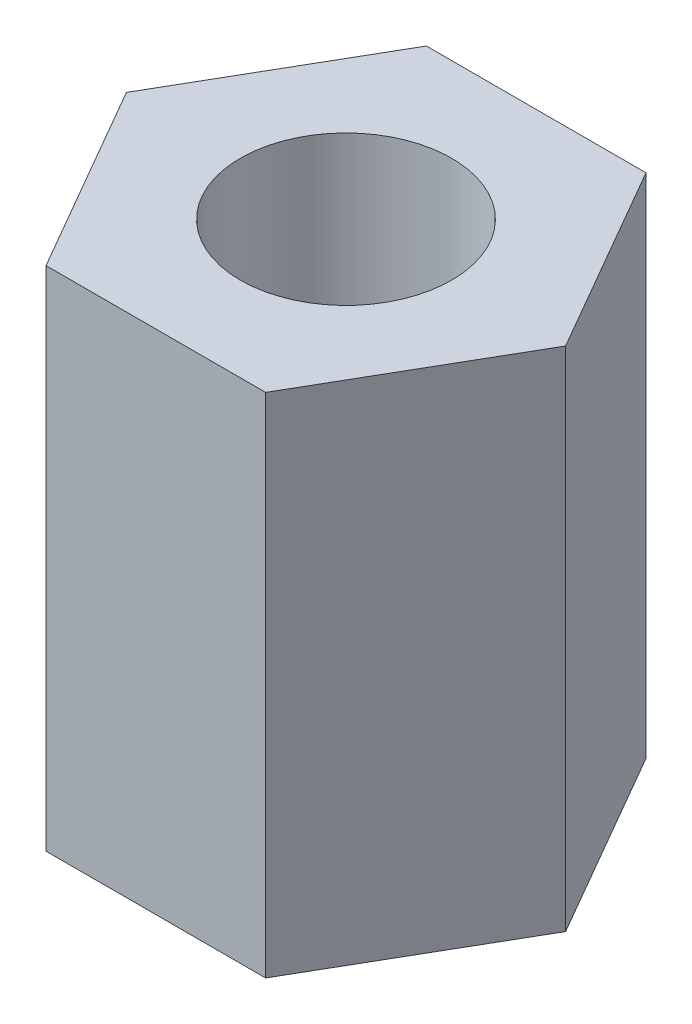
ISO-10303-21;
HEADER;
FILE_DESCRIPTION(('STEP AP214'),'2;1');
FILE_NAME('part.step','',(''),(''),'','','');
FILE_SCHEMA(('AUTOMOTIVE_DESIGN { 1 0 10303 214 1 1 1 1 }'));
ENDSEC;
DATA;
#1=APPLICATION_CONTEXT('core data for automotive mechanical design processes');
#2=APPLICATION_PROTOCOL_DEFINITION('international standard','automotive_design',2000,#1);
#3=PRODUCT_CONTEXT('',#1,'mechanical');
#4=PRODUCT('Part','Part','',(#3));
#5=PRODUCT_RELATED_PRODUCT_CATEGORY('part','',(#4));
#6=PRODUCT_DEFINITION_FORMATION('','',#4);
#7=PRODUCT_DEFINITION_CONTEXT('part definition',#1,'design');
#8=PRODUCT_DEFINITION('design','',#6,#7);
#9=PRODUCT_DEFINITION_SHAPE('','',#8);
#10=(LENGTH_UNIT() NAMED_UNIT(*) SI_UNIT(.MILLI.,.METRE.));
#11=(NAMED_UNIT(*) PLANE_ANGLE_UNIT() SI_UNIT($,.RADIAN.));
#12=(NAMED_UNIT(*) SI_UNIT($,.STERADIAN.) SOLID_ANGLE_UNIT());
#13=UNCERTAINTY_MEASURE_WITH_UNIT(LENGTH_MEASURE(1.E-05),#10,'distance_accuracy_value','');
#14=(GEOMETRIC_REPRESENTATION_CONTEXT(3) GLOBAL_UNCERTAINTY_ASSIGNED_CONTEXT((#13)) GLOBAL_UNIT_ASSIGNED_CONTEXT((#10,
#11,#12)) REPRESENTATION_CONTEXT('',''));
#15=CARTESIAN_POINT('',(0.,0.,0.));
#16=DIRECTION('',(0.,0.,1.));
#17=DIRECTION('',(1.,0.,0.));
#18=AXIS2_PLACEMENT_3D('',#15,#16,#17);
#19=CARTESIAN_POINT('',(0.,6.,0.));
#20=DIRECTION('',(0.,1.,0.));
#21=DIRECTION('',(0.,0.,1.));
#22=AXIS2_PLACEMENT_3D('',#19,#20,#21);
#23=PLANE('',#22);
#24=DIRECTION('',(1.,0.,0.));
#25=VECTOR('',#24,1.);
#26=CARTESIAN_POINT('',(-1.29903810567666,6.,2.25));
#27=LINE('',#26,#25);
#28=CARTESIAN_POINT('',(-1.29903810567666,6.,2.25));
#29=VERTEX_POINT('',#28);
#30=CARTESIAN_POINT('',(1.29903810567666,6.,2.25));
#31=VERTEX_POINT('',#30);
#32=EDGE_CURVE('E134',#29,#31,#27,.T.);
#33=ORIENTED_EDGE('',*,*,#32,.T.);
#34=DIRECTION('',(0.5,0.,-0.866025403784439));
#35=VECTOR('',#34,1.);
#36=CARTESIAN_POINT('',(1.29903810567666,6.,2.25));
#37=LINE('',#36,#35);
#38=CARTESIAN_POINT('',(2.59807621135332,6.,0.));
#39=VERTEX_POINT('',#38);
#40=EDGE_CURVE('E92',#31,#39,#37,.T.);
#41=ORIENTED_EDGE('',*,*,#40,.T.);
#42=DIRECTION('',(-0.5,0.,-0.866025403784438));
#43=VECTOR('',#42,1.);
#44=CARTESIAN_POINT('',(2.59807621135332,6.,0.));
#45=LINE('',#44,#43);
#46=CARTESIAN_POINT('',(1.29903810567666,6.,-2.25));
#47=VERTEX_POINT('',#46);
#48=EDGE_CURVE('E105',#39,#47,#45,.T.);
#49=ORIENTED_EDGE('',*,*,#48,.T.);
#50=DIRECTION('',(-1.,0.,0.));
#51=VECTOR('',#50,1.);
#52=CARTESIAN_POINT('',(1.29903810567666,6.,-2.25));
#53=LINE('',#52,#51);
#54=CARTESIAN_POINT('',(-1.29903810567666,6.,-2.25));
#55=VERTEX_POINT('',#54);
#56=EDGE_CURVE('E99',#47,#55,#53,.T.);
#57=ORIENTED_EDGE('',*,*,#56,.T.);
#58=DIRECTION('',(-0.5,0.,0.866025403784439));
#59=VECTOR('',#58,1.);
#60=CARTESIAN_POINT('',(-1.29903810567666,6.,-2.25));
#61=LINE('',#60,#59);
#62=CARTESIAN_POINT('',(-2.59807621135332,6.,0.));
#63=VERTEX_POINT('',#62);
#64=EDGE_CURVE('E103',#55,#63,#61,.T.);
#65=ORIENTED_EDGE('',*,*,#64,.T.);
#66=DIRECTION('',(0.5,0.,0.866025403784438));
#67=VECTOR('',#66,1.);
#68=CARTESIAN_POINT('',(-2.59807621135332,6.,0.));
#69=LINE('',#68,#67);
#70=EDGE_CURVE('E55',#63,#29,#69,.T.);
#71=ORIENTED_EDGE('',*,*,#70,.T.);
#72=EDGE_LOOP('',(#33,#41,#49,#57,#65,#71));
#73=FACE_BOUND('',#72,.T.);
#74=CARTESIAN_POINT('',(0.,6.,0.));
#75=DIRECTION('',(0.,1.,0.));
#76=DIRECTION('',(0.,0.,1.));
#77=AXIS2_PLACEMENT_3D('',#74,#75,#76);
#78=CIRCLE('',#77,1.25);
#79=CARTESIAN_POINT('',(0.,6.,1.25));
#80=VERTEX_POINT('',#79);
#81=EDGE_CURVE('E127',#80,#80,#78,.T.);
#82=ORIENTED_EDGE('',*,*,#81,.F.);
#83=EDGE_LOOP('',(#82));
#84=FACE_BOUND('',#83,.T.);
#85=ADVANCED_FACE('F38',(#73,#84),#23,.T.);
#86=CARTESIAN_POINT('',(0.,0.,0.));
#87=DIRECTION('',(0.,1.,0.));
#88=DIRECTION('',(0.,0.,1.));
#89=AXIS2_PLACEMENT_3D('',#86,#87,#88);
#90=PLANE('',#89);
#91=DIRECTION('',(1.,0.,0.));
#92=VECTOR('',#91,1.);
#93=CARTESIAN_POINT('',(-1.29903810567666,0.,2.25));
#94=LINE('',#93,#92);
#95=CARTESIAN_POINT('',(-1.29903810567666,0.,2.25));
#96=VERTEX_POINT('',#95);
#97=CARTESIAN_POINT('',(1.29903810567666,0.,2.25));
#98=VERTEX_POINT('',#97);
#99=EDGE_CURVE('E123',#96,#98,#94,.T.);
#100=ORIENTED_EDGE('',*,*,#99,.F.);
#101=DIRECTION('',(0.5,0.,0.866025403784438));
#102=VECTOR('',#101,1.);
#103=CARTESIAN_POINT('',(-2.59807621135332,0.,0.));
#104=LINE('',#103,#102);
#105=CARTESIAN_POINT('',(-2.59807621135332,0.,0.));
#106=VERTEX_POINT('',#105);
#107=EDGE_CURVE('E84',#106,#96,#104,.T.);
#108=ORIENTED_EDGE('',*,*,#107,.F.);
#109=DIRECTION('',(-0.5,0.,0.866025403784439));
#110=VECTOR('',#109,1.);
#111=CARTESIAN_POINT('',(-1.29903810567666,0.,-2.25));
#112=LINE('',#111,#110);
#113=CARTESIAN_POINT('',(-1.29903810567666,0.,-2.25));
#114=VERTEX_POINT('',#113);
#115=EDGE_CURVE('E78',#114,#106,#112,.T.);
#116=ORIENTED_EDGE('',*,*,#115,.F.);
#117=DIRECTION('',(-1.,0.,0.));
#118=VECTOR('',#117,1.);
#119=CARTESIAN_POINT('',(1.29903810567666,0.,-2.25));
#120=LINE('',#119,#118);
#121=CARTESIAN_POINT('',(1.29903810567666,0.,-2.25));
#122=VERTEX_POINT('',#121);
#123=EDGE_CURVE('E113',#122,#114,#120,.T.);
#124=ORIENTED_EDGE('',*,*,#123,.F.);
#125=DIRECTION('',(-0.5,0.,-0.866025403784438));
#126=VECTOR('',#125,1.);
#127=CARTESIAN_POINT('',(2.59807621135332,0.,0.));
#128=LINE('',#127,#126);
#129=CARTESIAN_POINT('',(2.59807621135332,0.,0.));
#130=VERTEX_POINT('',#129);
#131=EDGE_CURVE('E129',#130,#122,#128,.T.);
#132=ORIENTED_EDGE('',*,*,#131,.F.);
#133=DIRECTION('',(0.5,0.,-0.866025403784439));
#134=VECTOR('',#133,1.);
#135=CARTESIAN_POINT('',(1.29903810567666,0.,2.25));
#136=LINE('',#135,#134);
#137=EDGE_CURVE('E126',#98,#130,#136,.T.);
#138=ORIENTED_EDGE('',*,*,#137,.F.);
#139=EDGE_LOOP('',(#100,#108,#116,#124,#132,#138));
#140=FACE_BOUND('',#139,.T.);
#141=CARTESIAN_POINT('',(0.,0.,0.));
#142=DIRECTION('',(0.,1.,0.));
#143=DIRECTION('',(0.,0.,1.));
#144=AXIS2_PLACEMENT_3D('',#141,#142,#143);
#145=CIRCLE('',#144,1.25);
#146=CARTESIAN_POINT('',(0.,0.,1.25));
#147=VERTEX_POINT('',#146);
#148=EDGE_CURVE('E245',#147,#147,#145,.T.);
#149=ORIENTED_EDGE('',*,*,#148,.T.);
#150=EDGE_LOOP('',(#149));
#151=FACE_BOUND('',#150,.T.);
#152=ADVANCED_FACE('F143',(#140,#151),#90,.F.);
#153=CARTESIAN_POINT('',(-1.29903810567666,6.,2.25));
#154=DIRECTION('',(0.,0.,-1.));
#155=DIRECTION('',(-1.,0.,0.));
#156=AXIS2_PLACEMENT_3D('',#153,#154,#155);
#157=PLANE('',#156);
#158=ORIENTED_EDGE('',*,*,#99,.T.);
#159=DIRECTION('',(0.,-1.,0.));
#160=VECTOR('',#159,1.);
#161=CARTESIAN_POINT('',(1.29903810567666,6.,2.25));
#162=LINE('',#161,#160);
#163=EDGE_CURVE('E11',#31,#98,#162,.T.);
#164=ORIENTED_EDGE('',*,*,#163,.F.);
#165=ORIENTED_EDGE('',*,*,#32,.F.);
#166=DIRECTION('',(0.,-1.,0.));
#167=VECTOR('',#166,1.);
#168=CARTESIAN_POINT('',(-1.29903810567666,6.,2.25));
#169=LINE('',#168,#167);
#170=EDGE_CURVE('E119',#29,#96,#169,.T.);
#171=ORIENTED_EDGE('',*,*,#170,.T.);
#172=EDGE_LOOP('',(#158,#164,#165,#171));
#173=FACE_BOUND('',#172,.T.);
#174=ADVANCED_FACE('F40',(#173),#157,.F.);
#175=CARTESIAN_POINT('',(1.29903810567666,6.,2.25));
#176=DIRECTION('',(-0.866025403784438,0.,-0.5));
#177=DIRECTION('',(-0.5,0.,0.866025403784439));
#178=AXIS2_PLACEMENT_3D('',#175,#176,#177);
#179=PLANE('',#178);
#180=ORIENTED_EDGE('',*,*,#137,.T.);
#181=DIRECTION('',(0.,-1.,0.));
#182=VECTOR('',#181,1.);
#183=CARTESIAN_POINT('',(2.59807621135332,6.,0.));
#184=LINE('',#183,#182);
#185=EDGE_CURVE('E47',#39,#130,#184,.T.);
#186=ORIENTED_EDGE('',*,*,#185,.F.);
#187=ORIENTED_EDGE('',*,*,#40,.F.);
#188=ORIENTED_EDGE('',*,*,#163,.T.);
#189=EDGE_LOOP('',(#180,#186,#187,#188));
#190=FACE_BOUND('',#189,.T.);
#191=ADVANCED_FACE('F168',(#190),#179,.F.);
#192=CARTESIAN_POINT('',(2.59807621135332,6.,0.));
#193=DIRECTION('',(-0.866025403784438,0.,0.5));
#194=DIRECTION('',(0.5,0.,0.866025403784438));
#195=AXIS2_PLACEMENT_3D('',#192,#193,#194);
#196=PLANE('',#195);
#197=ORIENTED_EDGE('',*,*,#131,.T.);
#198=DIRECTION('',(0.,-1.,0.));
#199=VECTOR('',#198,1.);
#200=CARTESIAN_POINT('',(1.29903810567666,6.,-2.25));
#201=LINE('',#200,#199);
#202=EDGE_CURVE('E114',#47,#122,#201,.T.);
#203=ORIENTED_EDGE('',*,*,#202,.F.);
#204=ORIENTED_EDGE('',*,*,#48,.F.);
#205=ORIENTED_EDGE('',*,*,#185,.T.);
#206=EDGE_LOOP('',(#197,#203,#204,#205));
#207=FACE_BOUND('',#206,.T.);
#208=ADVANCED_FACE('F140',(#207),#196,.F.);
#209=CARTESIAN_POINT('',(1.29903810567666,6.,-2.25));
#210=DIRECTION('',(0.,0.,1.));
#211=DIRECTION('',(1.,0.,0.));
#212=AXIS2_PLACEMENT_3D('',#209,#210,#211);
#213=PLANE('',#212);
#214=ORIENTED_EDGE('',*,*,#123,.T.);
#215=DIRECTION('',(0.,-1.,0.));
#216=VECTOR('',#215,1.);
#217=CARTESIAN_POINT('',(-1.29903810567666,6.,-2.25));
#218=LINE('',#217,#216);
#219=EDGE_CURVE('E110',#55,#114,#218,.T.);
#220=ORIENTED_EDGE('',*,*,#219,.F.);
#221=ORIENTED_EDGE('',*,*,#56,.F.);
#222=ORIENTED_EDGE('',*,*,#202,.T.);
#223=EDGE_LOOP('',(#214,#220,#221,#222));
#224=FACE_BOUND('',#223,.T.);
#225=ADVANCED_FACE('F111',(#224),#213,.F.);
#226=CARTESIAN_POINT('',(-1.29903810567666,6.,-2.25));
#227=DIRECTION('',(0.866025403784438,0.,0.5));
#228=DIRECTION('',(0.5,0.,-0.866025403784439));
#229=AXIS2_PLACEMENT_3D('',#226,#227,#228);
#230=PLANE('',#229);
#231=ORIENTED_EDGE('',*,*,#115,.T.);
#232=DIRECTION('',(0.,-1.,0.));
#233=VECTOR('',#232,1.);
#234=CARTESIAN_POINT('',(-2.59807621135332,6.,0.));
#235=LINE('',#234,#233);
#236=EDGE_CURVE('E115',#63,#106,#235,.T.);
#237=ORIENTED_EDGE('',*,*,#236,.F.);
#238=ORIENTED_EDGE('',*,*,#64,.F.);
#239=ORIENTED_EDGE('',*,*,#219,.T.);
#240=EDGE_LOOP('',(#231,#237,#238,#239));
#241=FACE_BOUND('',#240,.T.);
#242=ADVANCED_FACE('F117',(#241),#230,.F.);
#243=CARTESIAN_POINT('',(-2.59807621135332,6.,0.));
#244=DIRECTION('',(0.866025403784439,0.,-0.5));
#245=DIRECTION('',(-0.5,0.,-0.866025403784439));
#246=AXIS2_PLACEMENT_3D('',#243,#244,#245);
#247=PLANE('',#246);
#248=ORIENTED_EDGE('',*,*,#107,.T.);
#249=ORIENTED_EDGE('',*,*,#170,.F.);
#250=ORIENTED_EDGE('',*,*,#70,.F.);
#251=ORIENTED_EDGE('',*,*,#236,.T.);
#252=EDGE_LOOP('',(#248,#249,#250,#251));
#253=FACE_BOUND('',#252,.T.);
#254=ADVANCED_FACE('F148',(#253),#247,.F.);
#255=CARTESIAN_POINT('',(0.,6.,0.));
#256=DIRECTION('',(0.,-1.,0.));
#257=DIRECTION('',(0.,0.,-1.));
#258=AXIS2_PLACEMENT_3D('',#255,#256,#257);
#259=CYLINDRICAL_SURFACE('',#258,1.25);
#260=ORIENTED_EDGE('',*,*,#81,.T.);
#261=EDGE_LOOP('',(#260));
#262=FACE_BOUND('',#261,.T.);
#263=ORIENTED_EDGE('',*,*,#148,.F.);
#264=EDGE_LOOP('',(#263));
#265=FACE_BOUND('',#264,.T.);
#266=ADVANCED_FACE('F150',(#262,#265),#259,.F.);
#267=CLOSED_SHELL('',(#85,#152,#174,#191,#208,#225,#242,#254,#266));
#268=MANIFOLD_SOLID_BREP('B2',#267);
#269=ADVANCED_BREP_SHAPE_REPRESENTATION('',(#18,#268),#14);
#270=SHAPE_DEFINITION_REPRESENTATION(#9,#269);
ENDSEC;
END-ISO-10303-21;
